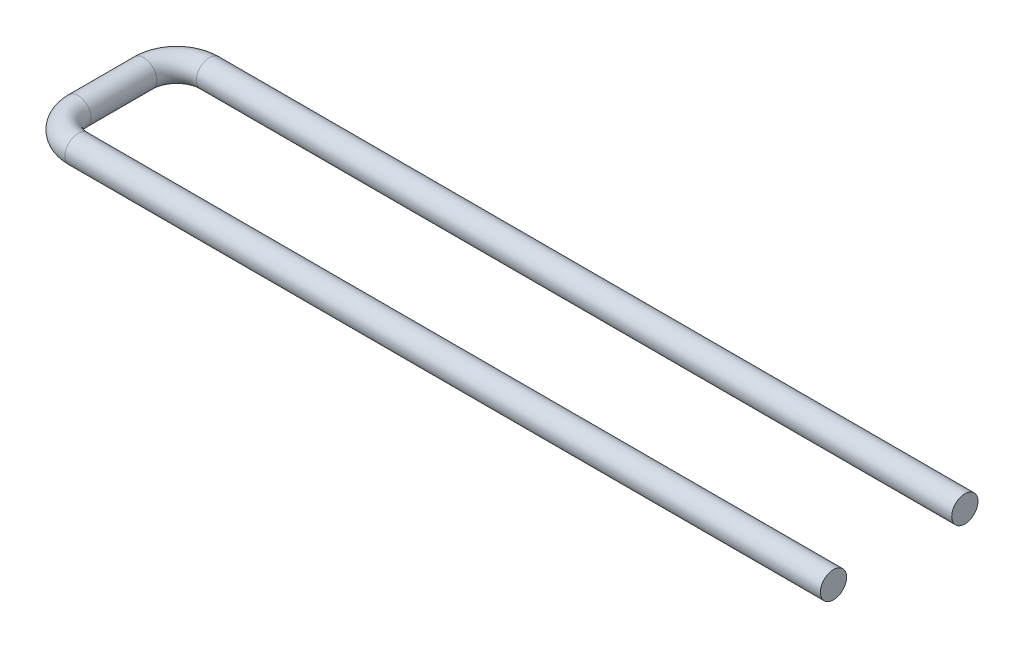
ISO-10303-21;
HEADER;
FILE_DESCRIPTION(('STEP AP214'),'2;1');
FILE_NAME('part.step','',(''),(''),'','','');
FILE_SCHEMA(('AUTOMOTIVE_DESIGN { 1 0 10303 214 1 1 1 1 }'));
ENDSEC;
DATA;
#1=APPLICATION_CONTEXT('core data for automotive mechanical design processes');
#2=APPLICATION_PROTOCOL_DEFINITION('international standard','automotive_design',2000,#1);
#3=PRODUCT_CONTEXT('',#1,'mechanical');
#4=PRODUCT('Part','Part','',(#3));
#5=PRODUCT_RELATED_PRODUCT_CATEGORY('part','',(#4));
#6=PRODUCT_DEFINITION_FORMATION('','',#4);
#7=PRODUCT_DEFINITION_CONTEXT('part definition',#1,'design');
#8=PRODUCT_DEFINITION('design','',#6,#7);
#9=PRODUCT_DEFINITION_SHAPE('','',#8);
#10=(LENGTH_UNIT() NAMED_UNIT(*) SI_UNIT(.MILLI.,.METRE.));
#11=(NAMED_UNIT(*) PLANE_ANGLE_UNIT() SI_UNIT($,.RADIAN.));
#12=(NAMED_UNIT(*) SI_UNIT($,.STERADIAN.) SOLID_ANGLE_UNIT());
#13=UNCERTAINTY_MEASURE_WITH_UNIT(LENGTH_MEASURE(1.E-05),#10,'distance_accuracy_value','');
#14=(GEOMETRIC_REPRESENTATION_CONTEXT(3) GLOBAL_UNCERTAINTY_ASSIGNED_CONTEXT((#13)) GLOBAL_UNIT_ASSIGNED_CONTEXT((#10,
#11,#12)) REPRESENTATION_CONTEXT('',''));
#15=CARTESIAN_POINT('',(0.,0.,0.));
#16=DIRECTION('',(0.,0.,1.));
#17=DIRECTION('',(1.,0.,0.));
#18=AXIS2_PLACEMENT_3D('',#15,#16,#17);
#19=CARTESIAN_POINT('',(-115.,0.,-20.));
#20=DIRECTION('',(1.,0.,0.));
#21=DIRECTION('',(0.,0.,-1.));
#22=AXIS2_PLACEMENT_3D('',#19,#20,#21);
#23=CYLINDRICAL_SURFACE('',#22,2.);
#24=CARTESIAN_POINT('',(-115.,0.,-20.));
#25=DIRECTION('',(-1.,0.,0.));
#26=DIRECTION('',(0.,0.,1.));
#27=AXIS2_PLACEMENT_3D('',#24,#25,#26);
#28=CIRCLE('',#27,2.);
#29=CARTESIAN_POINT('',(-115.,0.,-22.));
#30=VERTEX_POINT('',#29);
#31=EDGE_CURVE('E39',#30,#30,#28,.T.);
#32=ORIENTED_EDGE('',*,*,#31,.F.);
#33=EDGE_LOOP('',(#32));
#34=FACE_BOUND('',#33,.T.);
#35=CARTESIAN_POINT('',(0.,0.,-20.));
#36=DIRECTION('',(-1.,0.,0.));
#37=DIRECTION('',(0.,0.,1.));
#38=AXIS2_PLACEMENT_3D('',#35,#36,#37);
#39=CIRCLE('',#38,2.);
#40=CARTESIAN_POINT('',(0.,0.,-18.));
#41=VERTEX_POINT('',#40);
#42=EDGE_CURVE('E10',#41,#41,#39,.T.);
#43=ORIENTED_EDGE('',*,*,#42,.T.);
#44=EDGE_LOOP('',(#43));
#45=FACE_BOUND('',#44,.T.);
#46=ADVANCED_FACE('F33',(#34,#45),#23,.T.);
#47=CARTESIAN_POINT('',(-115.,0.,-15.));
#48=DIRECTION('',(0.,-1.,0.));
#49=DIRECTION('',(0.,0.,-1.));
#50=AXIS2_PLACEMENT_3D('',#47,#48,#49);
#51=TOROIDAL_SURFACE('',#50,4.99999999999999,2.);
#52=CARTESIAN_POINT('',(-120.,0.,-15.));
#53=DIRECTION('',(0.,0.,1.));
#54=DIRECTION('',(1.,0.,0.));
#55=AXIS2_PLACEMENT_3D('',#52,#53,#54);
#56=CIRCLE('',#55,2.);
#57=CARTESIAN_POINT('',(-122.,0.,-15.));
#58=VERTEX_POINT('',#57);
#59=EDGE_CURVE('E43',#58,#58,#56,.T.);
#60=CARTESIAN_POINT('',(-115.,0.,-15.));
#61=DIRECTION('',(0.,-1.,0.));
#62=DIRECTION('',(0.,0.,-1.));
#63=AXIS2_PLACEMENT_3D('',#60,#61,#62);
#64=CIRCLE('',#63,6.99999999999999);
#65=EDGE_CURVE('',#58,#30,#64,.T.);
#66=ORIENTED_EDGE('',*,*,#59,.F.);
#67=ORIENTED_EDGE('',*,*,#31,.T.);
#68=ORIENTED_EDGE('',*,*,#65,.T.);
#69=ORIENTED_EDGE('',*,*,#65,.F.);
#70=EDGE_LOOP('',(#66,#68,#67,#69));
#71=FACE_BOUND('',#70,.T.);
#72=ADVANCED_FACE('F71',(#71),#51,.T.);
#73=CARTESIAN_POINT('',(-120.,0.,-4.99999999999999));
#74=DIRECTION('',(0.,0.,-1.));
#75=DIRECTION('',(-1.,0.,0.));
#76=AXIS2_PLACEMENT_3D('',#73,#74,#75);
#77=CYLINDRICAL_SURFACE('',#76,2.);
#78=CARTESIAN_POINT('',(-120.,0.,-4.99999999999999));
#79=DIRECTION('',(0.,0.,1.));
#80=DIRECTION('',(1.,0.,0.));
#81=AXIS2_PLACEMENT_3D('',#78,#79,#80);
#82=CIRCLE('',#81,2.);
#83=CARTESIAN_POINT('',(-122.,0.,-4.99999999999999));
#84=VERTEX_POINT('',#83);
#85=EDGE_CURVE('E47',#84,#84,#82,.T.);
#86=ORIENTED_EDGE('',*,*,#85,.F.);
#87=EDGE_LOOP('',(#86));
#88=FACE_BOUND('',#87,.T.);
#89=ORIENTED_EDGE('',*,*,#59,.T.);
#90=EDGE_LOOP('',(#89));
#91=FACE_BOUND('',#90,.T.);
#92=ADVANCED_FACE('F65',(#88,#91),#77,.T.);
#93=CARTESIAN_POINT('',(-115.,0.,-4.99999999999999));
#94=DIRECTION('',(0.,-1.,0.));
#95=DIRECTION('',(0.,0.,-1.));
#96=AXIS2_PLACEMENT_3D('',#93,#94,#95);
#97=TOROIDAL_SURFACE('',#96,5.,2.);
#98=CARTESIAN_POINT('',(-115.,0.,0.));
#99=DIRECTION('',(1.,0.,0.));
#100=DIRECTION('',(0.,0.,-1.));
#101=AXIS2_PLACEMENT_3D('',#98,#99,#100);
#102=CIRCLE('',#101,2.);
#103=CARTESIAN_POINT('',(-115.,0.,2.00000000000001));
#104=VERTEX_POINT('',#103);
#105=EDGE_CURVE('E52',#104,#104,#102,.T.);
#106=CARTESIAN_POINT('',(-115.,0.,-4.99999999999999));
#107=DIRECTION('',(0.,-1.,0.));
#108=DIRECTION('',(0.,0.,-1.));
#109=AXIS2_PLACEMENT_3D('',#106,#107,#108);
#110=CIRCLE('',#109,7.);
#111=EDGE_CURVE('',#104,#84,#110,.T.);
#112=ORIENTED_EDGE('',*,*,#105,.F.);
#113=ORIENTED_EDGE('',*,*,#85,.T.);
#114=ORIENTED_EDGE('',*,*,#111,.T.);
#115=ORIENTED_EDGE('',*,*,#111,.F.);
#116=EDGE_LOOP('',(#112,#114,#113,#115));
#117=FACE_BOUND('',#116,.T.);
#118=ADVANCED_FACE('F62',(#117),#97,.T.);
#119=CARTESIAN_POINT('',(-115.,0.,0.));
#120=DIRECTION('',(1.,0.,0.));
#121=DIRECTION('',(0.,0.,-1.));
#122=AXIS2_PLACEMENT_3D('',#119,#120,#121);
#123=CYLINDRICAL_SURFACE('',#122,2.);
#124=ORIENTED_EDGE('',*,*,#105,.T.);
#125=EDGE_LOOP('',(#124));
#126=FACE_BOUND('',#125,.T.);
#127=CARTESIAN_POINT('',(0.,0.,0.));
#128=DIRECTION('',(1.,0.,0.));
#129=DIRECTION('',(0.,0.,-1.));
#130=AXIS2_PLACEMENT_3D('',#127,#128,#129);
#131=CIRCLE('',#130,2.);
#132=CARTESIAN_POINT('',(0.,0.,-2.));
#133=VERTEX_POINT('',#132);
#134=EDGE_CURVE('E53',#133,#133,#131,.T.);
#135=ORIENTED_EDGE('',*,*,#134,.F.);
#136=EDGE_LOOP('',(#135));
#137=FACE_BOUND('',#136,.T.);
#138=ADVANCED_FACE('F59',(#126,#137),#123,.T.);
#139=CARTESIAN_POINT('',(0.,0.,-20.));
#140=DIRECTION('',(-1.,0.,0.));
#141=DIRECTION('',(0.,0.,1.));
#142=AXIS2_PLACEMENT_3D('',#139,#140,#141);
#143=PLANE('',#142);
#144=ORIENTED_EDGE('',*,*,#42,.F.);
#145=EDGE_LOOP('',(#144));
#146=FACE_BOUND('',#145,.T.);
#147=ADVANCED_FACE('F83',(#146),#143,.F.);
#148=CARTESIAN_POINT('',(0.,0.,0.));
#149=DIRECTION('',(1.,0.,0.));
#150=DIRECTION('',(0.,0.,-1.));
#151=AXIS2_PLACEMENT_3D('',#148,#149,#150);
#152=PLANE('',#151);
#153=ORIENTED_EDGE('',*,*,#134,.T.);
#154=EDGE_LOOP('',(#153));
#155=FACE_BOUND('',#154,.T.);
#156=ADVANCED_FACE('F84',(#155),#152,.T.);
#157=CLOSED_SHELL('',(#46,#72,#92,#118,#138,#147,#156));
#158=MANIFOLD_SOLID_BREP('B2',#157);
#159=ADVANCED_BREP_SHAPE_REPRESENTATION('',(#18,#158),#14);
#160=SHAPE_DEFINITION_REPRESENTATION(#9,#159);
ENDSEC;
END-ISO-10303-21;
